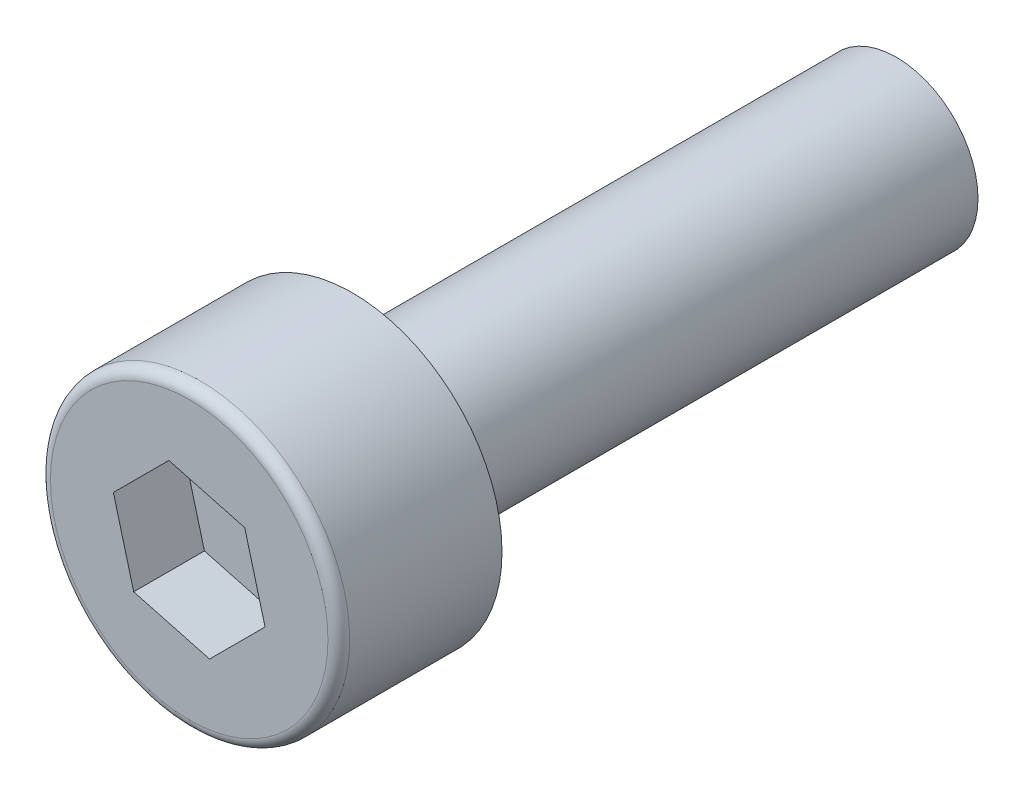
ISO-10303-21;
HEADER;
FILE_DESCRIPTION(('STEP AP214'),'2;1');
FILE_NAME('part.step','',(''),(''),'','','');
FILE_SCHEMA(('AUTOMOTIVE_DESIGN { 1 0 10303 214 1 1 1 1 }'));
ENDSEC;
DATA;
#1=APPLICATION_CONTEXT('core data for automotive mechanical design processes');
#2=APPLICATION_PROTOCOL_DEFINITION('international standard','automotive_design',2000,#1);
#3=PRODUCT_CONTEXT('',#1,'mechanical');
#4=PRODUCT('Part','Part','',(#3));
#5=PRODUCT_RELATED_PRODUCT_CATEGORY('part','',(#4));
#6=PRODUCT_DEFINITION_FORMATION('','',#4);
#7=PRODUCT_DEFINITION_CONTEXT('part definition',#1,'design');
#8=PRODUCT_DEFINITION('design','',#6,#7);
#9=PRODUCT_DEFINITION_SHAPE('','',#8);
#10=(LENGTH_UNIT() NAMED_UNIT(*) SI_UNIT(.MILLI.,.METRE.));
#11=(NAMED_UNIT(*) PLANE_ANGLE_UNIT() SI_UNIT($,.RADIAN.));
#12=(NAMED_UNIT(*) SI_UNIT($,.STERADIAN.) SOLID_ANGLE_UNIT());
#13=UNCERTAINTY_MEASURE_WITH_UNIT(LENGTH_MEASURE(1.E-05),#10,'distance_accuracy_value','');
#14=(GEOMETRIC_REPRESENTATION_CONTEXT(3) GLOBAL_UNCERTAINTY_ASSIGNED_CONTEXT((#13)) GLOBAL_UNIT_ASSIGNED_CONTEXT((#10,
#11,#12)) REPRESENTATION_CONTEXT('',''));
#15=CARTESIAN_POINT('',(0.,0.,0.));
#16=DIRECTION('',(0.,0.,1.));
#17=DIRECTION('',(1.,0.,0.));
#18=AXIS2_PLACEMENT_3D('',#15,#16,#17);
#19=CARTESIAN_POINT('',(0.,0.,0.));
#20=DIRECTION('',(0.,0.,1.));
#21=DIRECTION('',(1.,0.,0.));
#22=AXIS2_PLACEMENT_3D('',#19,#20,#21);
#23=PLANE('',#22);
#24=CARTESIAN_POINT('',(0.,0.,0.));
#25=DIRECTION('',(0.,0.,1.));
#26=DIRECTION('',(1.,0.,0.));
#27=AXIS2_PLACEMENT_3D('',#24,#25,#26);
#28=CIRCLE('',#27,2.75);
#29=CARTESIAN_POINT('',(2.75,0.,0.));
#30=VERTEX_POINT('',#29);
#31=EDGE_CURVE('E137',#30,#30,#28,.T.);
#32=ORIENTED_EDGE('',*,*,#31,.F.);
#33=EDGE_LOOP('',(#32));
#34=FACE_BOUND('',#33,.T.);
#35=CARTESIAN_POINT('',(0.,0.,0.));
#36=DIRECTION('',(0.,0.,1.));
#37=DIRECTION('',(1.,0.,0.));
#38=AXIS2_PLACEMENT_3D('',#35,#36,#37);
#39=CIRCLE('',#38,1.5);
#40=CARTESIAN_POINT('',(1.5,0.,0.));
#41=VERTEX_POINT('',#40);
#42=EDGE_CURVE('E145',#41,#41,#39,.F.);
#43=ORIENTED_EDGE('',*,*,#42,.F.);
#44=EDGE_LOOP('',(#43));
#45=FACE_BOUND('',#44,.T.);
#46=ADVANCED_FACE('F34',(#34,#45),#23,.F.);
#47=CARTESIAN_POINT('',(0.,0.,3.));
#48=DIRECTION('',(0.,0.,-1.));
#49=DIRECTION('',(-1.,0.,0.));
#50=AXIS2_PLACEMENT_3D('',#47,#48,#49);
#51=CYLINDRICAL_SURFACE('',#50,2.75);
#52=CARTESIAN_POINT('',(0.,0.,2.8));
#53=DIRECTION('',(0.,0.,1.));
#54=DIRECTION('',(1.,0.,0.));
#55=AXIS2_PLACEMENT_3D('',#52,#53,#54);
#56=CIRCLE('',#55,2.75);
#57=CARTESIAN_POINT('',(2.75,0.,2.8));
#58=VERTEX_POINT('',#57);
#59=EDGE_CURVE('E11',#58,#58,#56,.F.);
#60=ORIENTED_EDGE('',*,*,#59,.T.);
#61=EDGE_LOOP('',(#60));
#62=FACE_BOUND('',#61,.T.);
#63=ORIENTED_EDGE('',*,*,#31,.T.);
#64=EDGE_LOOP('',(#63));
#65=FACE_BOUND('',#64,.T.);
#66=ADVANCED_FACE('F164',(#62,#65),#51,.T.);
#67=CARTESIAN_POINT('',(0.,0.,3.));
#68=DIRECTION('',(0.,0.,1.));
#69=DIRECTION('',(1.,0.,0.));
#70=AXIS2_PLACEMENT_3D('',#67,#68,#69);
#71=PLANE('',#70);
#72=CARTESIAN_POINT('',(0.,0.,3.));
#73=DIRECTION('',(0.,0.,1.));
#74=DIRECTION('',(1.,0.,0.));
#75=AXIS2_PLACEMENT_3D('',#72,#73,#74);
#76=CIRCLE('',#75,2.55);
#77=CARTESIAN_POINT('',(2.55,0.,3.));
#78=VERTEX_POINT('',#77);
#79=EDGE_CURVE('E42',#78,#78,#76,.T.);
#80=ORIENTED_EDGE('',*,*,#79,.T.);
#81=EDGE_LOOP('',(#80));
#82=FACE_BOUND('',#81,.T.);
#83=DIRECTION('',(0.258819045102521,-0.965925826289068,0.));
#84=VECTOR('',#83,1.);
#85=CARTESIAN_POINT('',(-1.39419383956301,0.373573113403356,3.));
#86=LINE('',#85,#84);
#87=CARTESIAN_POINT('',(-1.39419383956301,0.373573113403356,3.));
#88=VERTEX_POINT('',#87);
#89=CARTESIAN_POINT('',(-1.02062072615966,-1.02062072615966,3.));
#90=VERTEX_POINT('',#89);
#91=EDGE_CURVE('E49',#88,#90,#86,.T.);
#92=ORIENTED_EDGE('',*,*,#91,.F.);
#93=DIRECTION('',(-0.707106781186548,-0.707106781186548,0.));
#94=VECTOR('',#93,1.);
#95=CARTESIAN_POINT('',(-0.373573113403355,1.39419383956301,3.));
#96=LINE('',#95,#94);
#97=CARTESIAN_POINT('',(-0.373573113403355,1.39419383956301,3.));
#98=VERTEX_POINT('',#97);
#99=EDGE_CURVE('E133',#98,#88,#96,.T.);
#100=ORIENTED_EDGE('',*,*,#99,.F.);
#101=DIRECTION('',(-0.965925826289068,0.258819045102521,0.));
#102=VECTOR('',#101,1.);
#103=CARTESIAN_POINT('',(1.02062072615966,1.02062072615966,3.));
#104=LINE('',#103,#102);
#105=CARTESIAN_POINT('',(1.02062072615966,1.02062072615966,3.));
#106=VERTEX_POINT('',#105);
#107=EDGE_CURVE('E131',#106,#98,#104,.T.);
#108=ORIENTED_EDGE('',*,*,#107,.F.);
#109=DIRECTION('',(-0.258819045102521,0.965925826289068,0.));
#110=VECTOR('',#109,1.);
#111=CARTESIAN_POINT('',(1.39419383956301,-0.373573113403355,3.));
#112=LINE('',#111,#110);
#113=CARTESIAN_POINT('',(1.39419383956301,-0.373573113403355,3.));
#114=VERTEX_POINT('',#113);
#115=EDGE_CURVE('E97',#114,#106,#112,.T.);
#116=ORIENTED_EDGE('',*,*,#115,.F.);
#117=DIRECTION('',(0.707106781186548,0.707106781186548,0.));
#118=VECTOR('',#117,1.);
#119=CARTESIAN_POINT('',(0.373573113403355,-1.39419383956301,3.));
#120=LINE('',#119,#118);
#121=CARTESIAN_POINT('',(0.373573113403355,-1.39419383956301,3.));
#122=VERTEX_POINT('',#121);
#123=EDGE_CURVE('E127',#122,#114,#120,.T.);
#124=ORIENTED_EDGE('',*,*,#123,.F.);
#125=DIRECTION('',(0.965925826289068,-0.258819045102521,0.));
#126=VECTOR('',#125,1.);
#127=CARTESIAN_POINT('',(-1.02062072615966,-1.02062072615966,3.));
#128=LINE('',#127,#126);
#129=EDGE_CURVE('E123',#90,#122,#128,.T.);
#130=ORIENTED_EDGE('',*,*,#129,.F.);
#131=EDGE_LOOP('',(#92,#100,#108,#116,#124,#130));
#132=FACE_BOUND('',#131,.T.);
#133=ADVANCED_FACE('F150',(#82,#132),#71,.T.);
#134=CARTESIAN_POINT('',(-1.39419383956301,0.373573113403356,1.7));
#135=DIRECTION('',(-0.965925826289068,-0.258819045102521,0.));
#136=DIRECTION('',(0.258819045102521,-0.965925826289068,0.));
#137=AXIS2_PLACEMENT_3D('',#134,#135,#136);
#138=PLANE('',#137);
#139=ORIENTED_EDGE('',*,*,#91,.T.);
#140=DIRECTION('',(0.,0.,1.));
#141=VECTOR('',#140,1.);
#142=CARTESIAN_POINT('',(-1.02062072615966,-1.02062072615966,1.7));
#143=LINE('',#142,#141);
#144=CARTESIAN_POINT('',(-1.02062072615966,-1.02062072615966,1.7));
#145=VERTEX_POINT('',#144);
#146=EDGE_CURVE('E79',#145,#90,#143,.T.);
#147=ORIENTED_EDGE('',*,*,#146,.F.);
#148=DIRECTION('',(0.258819045102521,-0.965925826289068,0.));
#149=VECTOR('',#148,1.);
#150=CARTESIAN_POINT('',(-1.39419383956301,0.373573113403356,1.7));
#151=LINE('',#150,#149);
#152=CARTESIAN_POINT('',(-1.39419383956301,0.373573113403356,1.7));
#153=VERTEX_POINT('',#152);
#154=EDGE_CURVE('E135',#153,#145,#151,.T.);
#155=ORIENTED_EDGE('',*,*,#154,.F.);
#156=DIRECTION('',(0.,0.,1.));
#157=VECTOR('',#156,1.);
#158=CARTESIAN_POINT('',(-1.39419383956301,0.373573113403356,1.7));
#159=LINE('',#158,#157);
#160=EDGE_CURVE('E57',#153,#88,#159,.T.);
#161=ORIENTED_EDGE('',*,*,#160,.T.);
#162=EDGE_LOOP('',(#139,#147,#155,#161));
#163=FACE_BOUND('',#162,.T.);
#164=ADVANCED_FACE('F176',(#163),#138,.F.);
#165=CARTESIAN_POINT('',(-0.373573113403355,1.39419383956301,1.7));
#166=DIRECTION('',(-0.707106781186548,0.707106781186548,0.));
#167=DIRECTION('',(-0.707106781186548,-0.707106781186548,0.));
#168=AXIS2_PLACEMENT_3D('',#165,#166,#167);
#169=PLANE('',#168);
#170=ORIENTED_EDGE('',*,*,#99,.T.);
#171=ORIENTED_EDGE('',*,*,#160,.F.);
#172=DIRECTION('',(-0.707106781186548,-0.707106781186548,0.));
#173=VECTOR('',#172,1.);
#174=CARTESIAN_POINT('',(-0.373573113403355,1.39419383956301,1.7));
#175=LINE('',#174,#173);
#176=CARTESIAN_POINT('',(-0.373573113403355,1.39419383956301,1.7));
#177=VERTEX_POINT('',#176);
#178=EDGE_CURVE('E109',#177,#153,#175,.T.);
#179=ORIENTED_EDGE('',*,*,#178,.F.);
#180=DIRECTION('',(0.,0.,1.));
#181=VECTOR('',#180,1.);
#182=CARTESIAN_POINT('',(-0.373573113403355,1.39419383956301,1.7));
#183=LINE('',#182,#181);
#184=EDGE_CURVE('E101',#177,#98,#183,.T.);
#185=ORIENTED_EDGE('',*,*,#184,.T.);
#186=EDGE_LOOP('',(#170,#171,#179,#185));
#187=FACE_BOUND('',#186,.T.);
#188=ADVANCED_FACE('F179',(#187),#169,.F.);
#189=CARTESIAN_POINT('',(1.02062072615966,1.02062072615966,1.7));
#190=DIRECTION('',(0.258819045102521,0.965925826289068,0.));
#191=DIRECTION('',(-0.965925826289068,0.258819045102521,0.));
#192=AXIS2_PLACEMENT_3D('',#189,#190,#191);
#193=PLANE('',#192);
#194=ORIENTED_EDGE('',*,*,#107,.T.);
#195=ORIENTED_EDGE('',*,*,#184,.F.);
#196=DIRECTION('',(-0.965925826289068,0.258819045102521,0.));
#197=VECTOR('',#196,1.);
#198=CARTESIAN_POINT('',(1.02062072615966,1.02062072615966,1.7));
#199=LINE('',#198,#197);
#200=CARTESIAN_POINT('',(1.02062072615966,1.02062072615966,1.7));
#201=VERTEX_POINT('',#200);
#202=EDGE_CURVE('E105',#201,#177,#199,.T.);
#203=ORIENTED_EDGE('',*,*,#202,.F.);
#204=DIRECTION('',(0.,0.,1.));
#205=VECTOR('',#204,1.);
#206=CARTESIAN_POINT('',(1.02062072615966,1.02062072615966,1.7));
#207=LINE('',#206,#205);
#208=EDGE_CURVE('E90',#201,#106,#207,.T.);
#209=ORIENTED_EDGE('',*,*,#208,.T.);
#210=EDGE_LOOP('',(#194,#195,#203,#209));
#211=FACE_BOUND('',#210,.T.);
#212=ADVANCED_FACE('F106',(#211),#193,.F.);
#213=CARTESIAN_POINT('',(1.39419383956301,-0.373573113403355,1.7));
#214=DIRECTION('',(0.965925826289068,0.258819045102521,0.));
#215=DIRECTION('',(-0.258819045102521,0.965925826289068,0.));
#216=AXIS2_PLACEMENT_3D('',#213,#214,#215);
#217=PLANE('',#216);
#218=ORIENTED_EDGE('',*,*,#115,.T.);
#219=ORIENTED_EDGE('',*,*,#208,.F.);
#220=DIRECTION('',(-0.258819045102521,0.965925826289068,0.));
#221=VECTOR('',#220,1.);
#222=CARTESIAN_POINT('',(1.39419383956301,-0.373573113403355,1.7));
#223=LINE('',#222,#221);
#224=CARTESIAN_POINT('',(1.39419383956301,-0.373573113403355,1.7));
#225=VERTEX_POINT('',#224);
#226=EDGE_CURVE('E94',#225,#201,#223,.T.);
#227=ORIENTED_EDGE('',*,*,#226,.F.);
#228=DIRECTION('',(0.,0.,1.));
#229=VECTOR('',#228,1.);
#230=CARTESIAN_POINT('',(1.39419383956301,-0.373573113403355,1.7));
#231=LINE('',#230,#229);
#232=EDGE_CURVE('E102',#225,#114,#231,.T.);
#233=ORIENTED_EDGE('',*,*,#232,.T.);
#234=EDGE_LOOP('',(#218,#219,#227,#233));
#235=FACE_BOUND('',#234,.T.);
#236=ADVANCED_FACE('F92',(#235),#217,.F.);
#237=CARTESIAN_POINT('',(0.373573113403355,-1.39419383956301,1.7));
#238=DIRECTION('',(0.707106781186548,-0.707106781186548,0.));
#239=DIRECTION('',(0.707106781186548,0.707106781186548,0.));
#240=AXIS2_PLACEMENT_3D('',#237,#238,#239);
#241=PLANE('',#240);
#242=ORIENTED_EDGE('',*,*,#123,.T.);
#243=ORIENTED_EDGE('',*,*,#232,.F.);
#244=DIRECTION('',(0.707106781186548,0.707106781186548,0.));
#245=VECTOR('',#244,1.);
#246=CARTESIAN_POINT('',(0.373573113403355,-1.39419383956301,1.7));
#247=LINE('',#246,#245);
#248=CARTESIAN_POINT('',(0.373573113403355,-1.39419383956301,1.7));
#249=VERTEX_POINT('',#248);
#250=EDGE_CURVE('E115',#249,#225,#247,.T.);
#251=ORIENTED_EDGE('',*,*,#250,.F.);
#252=DIRECTION('',(0.,0.,1.));
#253=VECTOR('',#252,1.);
#254=CARTESIAN_POINT('',(0.373573113403355,-1.39419383956301,1.7));
#255=LINE('',#254,#253);
#256=EDGE_CURVE('E140',#249,#122,#255,.T.);
#257=ORIENTED_EDGE('',*,*,#256,.T.);
#258=EDGE_LOOP('',(#242,#243,#251,#257));
#259=FACE_BOUND('',#258,.T.);
#260=ADVANCED_FACE('F183',(#259),#241,.F.);
#261=CARTESIAN_POINT('',(-1.02062072615966,-1.02062072615966,1.7));
#262=DIRECTION('',(-0.258819045102521,-0.965925826289068,0.));
#263=DIRECTION('',(0.965925826289068,-0.258819045102521,0.));
#264=AXIS2_PLACEMENT_3D('',#261,#262,#263);
#265=PLANE('',#264);
#266=ORIENTED_EDGE('',*,*,#129,.T.);
#267=ORIENTED_EDGE('',*,*,#256,.F.);
#268=DIRECTION('',(0.965925826289068,-0.258819045102521,0.));
#269=VECTOR('',#268,1.);
#270=CARTESIAN_POINT('',(-1.02062072615966,-1.02062072615966,1.7));
#271=LINE('',#270,#269);
#272=EDGE_CURVE('E117',#145,#249,#271,.T.);
#273=ORIENTED_EDGE('',*,*,#272,.F.);
#274=ORIENTED_EDGE('',*,*,#146,.T.);
#275=EDGE_LOOP('',(#266,#267,#273,#274));
#276=FACE_BOUND('',#275,.T.);
#277=ADVANCED_FACE('F180',(#276),#265,.F.);
#278=CARTESIAN_POINT('',(0.,0.,1.7));
#279=DIRECTION('',(0.,0.,1.));
#280=DIRECTION('',(1.,0.,0.));
#281=AXIS2_PLACEMENT_3D('',#278,#279,#280);
#282=PLANE('',#281);
#283=ORIENTED_EDGE('',*,*,#154,.T.);
#284=ORIENTED_EDGE('',*,*,#272,.T.);
#285=ORIENTED_EDGE('',*,*,#250,.T.);
#286=ORIENTED_EDGE('',*,*,#226,.T.);
#287=ORIENTED_EDGE('',*,*,#202,.T.);
#288=ORIENTED_EDGE('',*,*,#178,.T.);
#289=EDGE_LOOP('',(#283,#284,#285,#286,#287,#288));
#290=FACE_BOUND('',#289,.T.);
#291=ADVANCED_FACE('F112',(#290),#282,.T.);
#292=CARTESIAN_POINT('',(0.,0.,-10.));
#293=DIRECTION('',(0.,0.,1.));
#294=DIRECTION('',(1.,0.,0.));
#295=AXIS2_PLACEMENT_3D('',#292,#293,#294);
#296=CYLINDRICAL_SURFACE('',#295,1.5);
#297=CARTESIAN_POINT('',(0.,0.,-10.));
#298=DIRECTION('',(0.,0.,-1.));
#299=DIRECTION('',(-1.,0.,0.));
#300=AXIS2_PLACEMENT_3D('',#297,#298,#299);
#301=CIRCLE('',#300,1.5);
#302=CARTESIAN_POINT('',(-1.5,0.,-10.));
#303=VERTEX_POINT('',#302);
#304=EDGE_CURVE('E124',#303,#303,#301,.T.);
#305=ORIENTED_EDGE('',*,*,#304,.F.);
#306=EDGE_LOOP('',(#305));
#307=FACE_BOUND('',#306,.T.);
#308=ORIENTED_EDGE('',*,*,#42,.T.);
#309=EDGE_LOOP('',(#308));
#310=FACE_BOUND('',#309,.T.);
#311=ADVANCED_FACE('F159',(#307,#310),#296,.T.);
#312=CARTESIAN_POINT('',(0.,0.,-10.));
#313=DIRECTION('',(0.,0.,-1.));
#314=DIRECTION('',(-1.,0.,0.));
#315=AXIS2_PLACEMENT_3D('',#312,#313,#314);
#316=PLANE('',#315);
#317=ORIENTED_EDGE('',*,*,#304,.T.);
#318=EDGE_LOOP('',(#317));
#319=FACE_BOUND('',#318,.T.);
#320=ADVANCED_FACE('F154',(#319),#316,.T.);
#321=CARTESIAN_POINT('',(0.,0.,2.8));
#322=DIRECTION('',(0.,0.,1.));
#323=DIRECTION('',(1.,0.,0.));
#324=AXIS2_PLACEMENT_3D('',#321,#322,#323);
#325=TOROIDAL_SURFACE('',#324,2.55,0.2);
#326=ORIENTED_EDGE('',*,*,#59,.F.);
#327=EDGE_LOOP('',(#326));
#328=FACE_BOUND('',#327,.T.);
#329=ORIENTED_EDGE('',*,*,#79,.F.);
#330=EDGE_LOOP('',(#329));
#331=FACE_BOUND('',#330,.T.);
#332=ADVANCED_FACE('F36',(#328,#331),#325,.T.);
#333=CLOSED_SHELL('',(#46,#66,#133,#164,#188,#212,#236,#260,#277,#291,#311,#320,#332));
#334=MANIFOLD_SOLID_BREP('B2',#333);
#335=ADVANCED_BREP_SHAPE_REPRESENTATION('',(#18,#334),#14);
#336=SHAPE_DEFINITION_REPRESENTATION(#9,#335);
ENDSEC;
END-ISO-10303-21;
